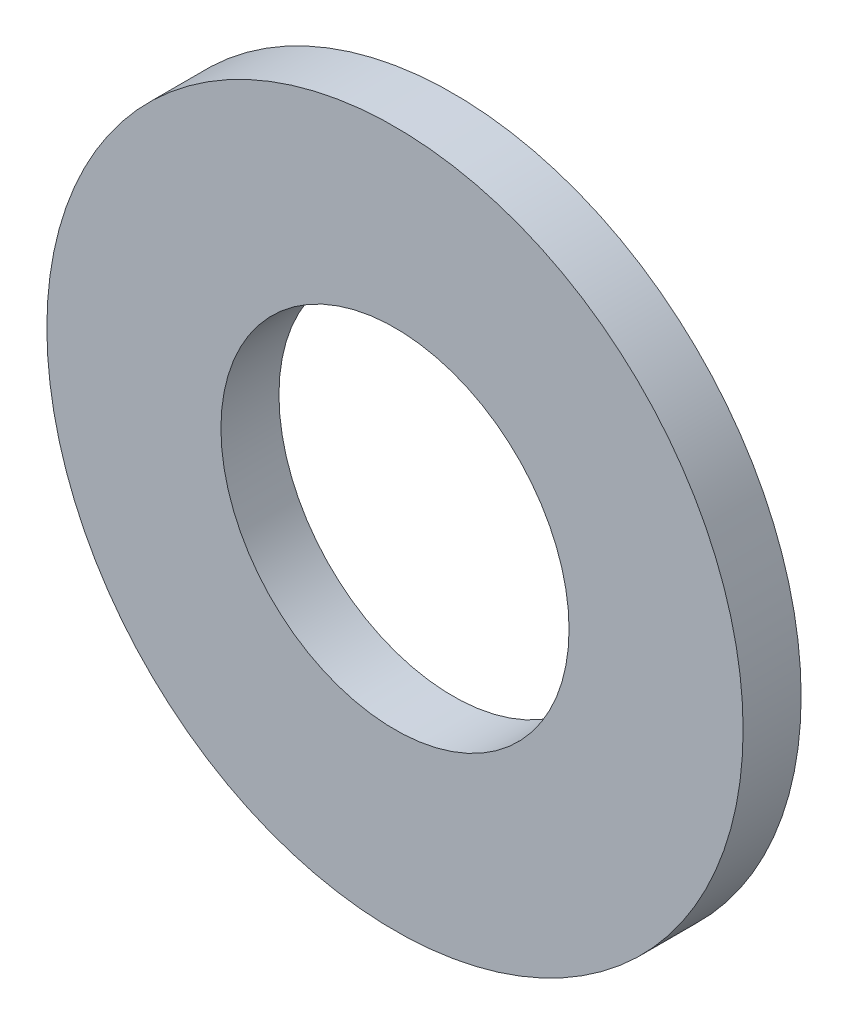
ISO-10303-21;
HEADER;
FILE_DESCRIPTION(('STEP AP214'),'2;1');
FILE_NAME('part.step','',(''),(''),'','','');
FILE_SCHEMA(('AUTOMOTIVE_DESIGN { 1 0 10303 214 1 1 1 1 }'));
ENDSEC;
DATA;
#1=APPLICATION_CONTEXT('core data for automotive mechanical design processes');
#2=APPLICATION_PROTOCOL_DEFINITION('international standard','automotive_design',2000,#1);
#3=PRODUCT_CONTEXT('',#1,'mechanical');
#4=PRODUCT('Part','Part','',(#3));
#5=PRODUCT_RELATED_PRODUCT_CATEGORY('part','',(#4));
#6=PRODUCT_DEFINITION_FORMATION('','',#4);
#7=PRODUCT_DEFINITION_CONTEXT('part definition',#1,'design');
#8=PRODUCT_DEFINITION('design','',#6,#7);
#9=PRODUCT_DEFINITION_SHAPE('','',#8);
#10=(LENGTH_UNIT() NAMED_UNIT(*) SI_UNIT(.MILLI.,.METRE.));
#11=(NAMED_UNIT(*) PLANE_ANGLE_UNIT() SI_UNIT($,.RADIAN.));
#12=(NAMED_UNIT(*) SI_UNIT($,.STERADIAN.) SOLID_ANGLE_UNIT());
#13=UNCERTAINTY_MEASURE_WITH_UNIT(LENGTH_MEASURE(1.E-05),#10,'distance_accuracy_value','');
#14=(GEOMETRIC_REPRESENTATION_CONTEXT(3) GLOBAL_UNCERTAINTY_ASSIGNED_CONTEXT((#13)) GLOBAL_UNIT_ASSIGNED_CONTEXT((#10,
#11,#12)) REPRESENTATION_CONTEXT('',''));
#15=CARTESIAN_POINT('',(0.,0.,0.));
#16=DIRECTION('',(0.,0.,1.));
#17=DIRECTION('',(1.,0.,0.));
#18=AXIS2_PLACEMENT_3D('',#15,#16,#17);
#19=CARTESIAN_POINT('',(0.,0.,4.));
#20=DIRECTION('',(0.,0.,1.));
#21=DIRECTION('',(1.,0.,0.));
#22=AXIS2_PLACEMENT_3D('',#19,#20,#21);
#23=PLANE('',#22);
#24=CARTESIAN_POINT('',(0.,0.,4.));
#25=DIRECTION('',(0.,0.,1.));
#26=DIRECTION('',(1.,0.,0.));
#27=AXIS2_PLACEMENT_3D('',#24,#25,#26);
#28=CIRCLE('',#27,24.);
#29=CARTESIAN_POINT('',(24.,0.,4.));
#30=VERTEX_POINT('',#29);
#31=EDGE_CURVE('E10',#30,#30,#28,.T.);
#32=ORIENTED_EDGE('',*,*,#31,.T.);
#33=EDGE_LOOP('',(#32));
#34=FACE_BOUND('',#33,.T.);
#35=CARTESIAN_POINT('',(0.,0.,4.));
#36=DIRECTION('',(0.,0.,1.));
#37=DIRECTION('',(1.,0.,0.));
#38=AXIS2_PLACEMENT_3D('',#35,#36,#37);
#39=CIRCLE('',#38,12.);
#40=CARTESIAN_POINT('',(12.,0.,4.));
#41=VERTEX_POINT('',#40);
#42=EDGE_CURVE('E42',#41,#41,#39,.T.);
#43=ORIENTED_EDGE('',*,*,#42,.F.);
#44=EDGE_LOOP('',(#43));
#45=FACE_BOUND('',#44,.T.);
#46=ADVANCED_FACE('F31',(#34,#45),#23,.T.);
#47=CARTESIAN_POINT('',(0.,0.,0.));
#48=DIRECTION('',(0.,0.,1.));
#49=DIRECTION('',(1.,0.,0.));
#50=AXIS2_PLACEMENT_3D('',#47,#48,#49);
#51=PLANE('',#50);
#52=CARTESIAN_POINT('',(0.,0.,0.));
#53=DIRECTION('',(0.,0.,1.));
#54=DIRECTION('',(1.,0.,0.));
#55=AXIS2_PLACEMENT_3D('',#52,#53,#54);
#56=CIRCLE('',#55,24.);
#57=CARTESIAN_POINT('',(24.,0.,0.));
#58=VERTEX_POINT('',#57);
#59=EDGE_CURVE('E35',#58,#58,#56,.T.);
#60=ORIENTED_EDGE('',*,*,#59,.F.);
#61=EDGE_LOOP('',(#60));
#62=FACE_BOUND('',#61,.T.);
#63=CARTESIAN_POINT('',(0.,0.,0.));
#64=DIRECTION('',(0.,0.,1.));
#65=DIRECTION('',(1.,0.,0.));
#66=AXIS2_PLACEMENT_3D('',#63,#64,#65);
#67=CIRCLE('',#66,12.);
#68=CARTESIAN_POINT('',(12.,0.,0.));
#69=VERTEX_POINT('',#68);
#70=EDGE_CURVE('E44',#69,#69,#67,.T.);
#71=ORIENTED_EDGE('',*,*,#70,.T.);
#72=EDGE_LOOP('',(#71));
#73=FACE_BOUND('',#72,.T.);
#74=ADVANCED_FACE('F54',(#62,#73),#51,.F.);
#75=CARTESIAN_POINT('',(0.,0.,4.));
#76=DIRECTION('',(0.,0.,-1.));
#77=DIRECTION('',(-1.,0.,0.));
#78=AXIS2_PLACEMENT_3D('',#75,#76,#77);
#79=CYLINDRICAL_SURFACE('',#78,24.);
#80=ORIENTED_EDGE('',*,*,#31,.F.);
#81=EDGE_LOOP('',(#80));
#82=FACE_BOUND('',#81,.T.);
#83=ORIENTED_EDGE('',*,*,#59,.T.);
#84=EDGE_LOOP('',(#83));
#85=FACE_BOUND('',#84,.T.);
#86=ADVANCED_FACE('F33',(#82,#85),#79,.T.);
#87=CARTESIAN_POINT('',(0.,0.,4.));
#88=DIRECTION('',(0.,0.,-1.));
#89=DIRECTION('',(-1.,0.,0.));
#90=AXIS2_PLACEMENT_3D('',#87,#88,#89);
#91=CYLINDRICAL_SURFACE('',#90,12.);
#92=ORIENTED_EDGE('',*,*,#42,.T.);
#93=EDGE_LOOP('',(#92));
#94=FACE_BOUND('',#93,.T.);
#95=ORIENTED_EDGE('',*,*,#70,.F.);
#96=EDGE_LOOP('',(#95));
#97=FACE_BOUND('',#96,.T.);
#98=ADVANCED_FACE('F50',(#94,#97),#91,.F.);
#99=CLOSED_SHELL('',(#46,#74,#86,#98));
#100=MANIFOLD_SOLID_BREP('B2',#99);
#101=ADVANCED_BREP_SHAPE_REPRESENTATION('',(#18,#100),#14);
#102=SHAPE_DEFINITION_REPRESENTATION(#9,#101);
ENDSEC;
END-ISO-10303-21;
